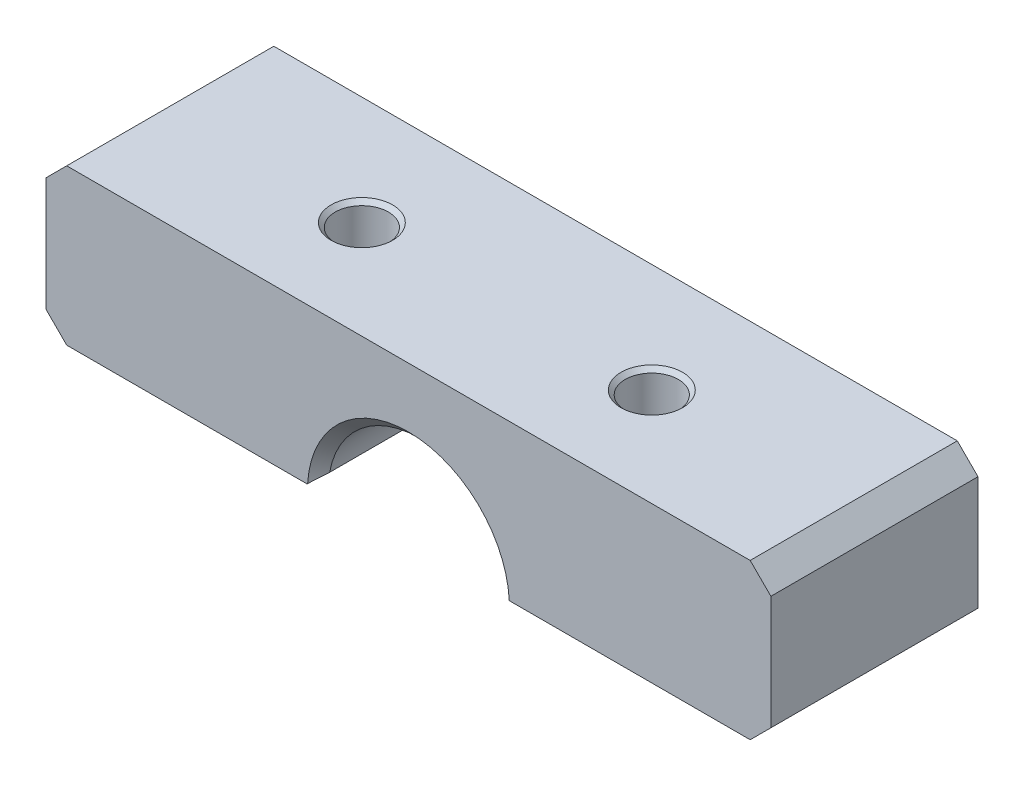
ISO-10303-21;
HEADER;
FILE_DESCRIPTION(('STEP AP214'),'2;1');
FILE_NAME('part.step','',(''),(''),'','','');
FILE_SCHEMA(('AUTOMOTIVE_DESIGN { 1 0 10303 214 1 1 1 1 }'));
ENDSEC;
DATA;
#1=APPLICATION_CONTEXT('core data for automotive mechanical design processes');
#2=APPLICATION_PROTOCOL_DEFINITION('international standard','automotive_design',2000,#1);
#3=PRODUCT_CONTEXT('',#1,'mechanical');
#4=PRODUCT('Part','Part','',(#3));
#5=PRODUCT_RELATED_PRODUCT_CATEGORY('part','',(#4));
#6=PRODUCT_DEFINITION_FORMATION('','',#4);
#7=PRODUCT_DEFINITION_CONTEXT('part definition',#1,'design');
#8=PRODUCT_DEFINITION('design','',#6,#7);
#9=PRODUCT_DEFINITION_SHAPE('','',#8);
#10=(LENGTH_UNIT() NAMED_UNIT(*) SI_UNIT(.MILLI.,.METRE.));
#11=(NAMED_UNIT(*) PLANE_ANGLE_UNIT() SI_UNIT($,.RADIAN.));
#12=(NAMED_UNIT(*) SI_UNIT($,.STERADIAN.) SOLID_ANGLE_UNIT());
#13=UNCERTAINTY_MEASURE_WITH_UNIT(LENGTH_MEASURE(1.E-05),#10,'distance_accuracy_value','');
#14=(GEOMETRIC_REPRESENTATION_CONTEXT(3) GLOBAL_UNCERTAINTY_ASSIGNED_CONTEXT((#13)) GLOBAL_UNIT_ASSIGNED_CONTEXT((#10,
#11,#12)) REPRESENTATION_CONTEXT('',''));
#15=CARTESIAN_POINT('',(0.,0.,0.));
#16=DIRECTION('',(0.,0.,1.));
#17=DIRECTION('',(1.,0.,0.));
#18=AXIS2_PLACEMENT_3D('',#15,#16,#17);
#19=CARTESIAN_POINT('',(0.,19.685,9.525));
#20=DIRECTION('',(0.,1.,0.));
#21=DIRECTION('',(-1.,0.,0.));
#22=AXIS2_PLACEMENT_3D('',#19,#20,#21);
#23=PLANE('',#22);
#24=CARTESIAN_POINT('',(-17.78,19.685,22.86));
#25=DIRECTION('',(0.,1.,0.));
#26=DIRECTION('',(-1.,0.,0.));
#27=AXIS2_PLACEMENT_3D('',#24,#25,#26);
#28=CIRCLE('',#27,3.77190000000004);
#29=CARTESIAN_POINT('',(-21.5519,19.685,22.86));
#30=VERTEX_POINT('',#29);
#31=EDGE_CURVE('E11',#30,#30,#28,.F.);
#32=ORIENTED_EDGE('',*,*,#31,.T.);
#33=EDGE_LOOP('',(#32));
#34=FACE_BOUND('',#33,.T.);
#35=CARTESIAN_POINT('',(17.78,19.685,22.86));
#36=DIRECTION('',(0.,1.,0.));
#37=DIRECTION('',(-1.,0.,0.));
#38=AXIS2_PLACEMENT_3D('',#35,#36,#37);
#39=CIRCLE('',#38,3.77190000000002);
#40=CARTESIAN_POINT('',(14.0081,19.685,22.86));
#41=VERTEX_POINT('',#40);
#42=EDGE_CURVE('E56',#41,#41,#39,.F.);
#43=ORIENTED_EDGE('',*,*,#42,.T.);
#44=EDGE_LOOP('',(#43));
#45=FACE_BOUND('',#44,.T.);
#46=DIRECTION('',(-1.,0.,0.));
#47=VECTOR('',#46,1.);
#48=CARTESIAN_POINT('',(0.,19.685,9.525));
#49=LINE('',#48,#47);
#50=CARTESIAN_POINT('',(41.91,19.685,9.525));
#51=VERTEX_POINT('',#50);
#52=CARTESIAN_POINT('',(-41.91,19.685,9.525));
#53=VERTEX_POINT('',#52);
#54=EDGE_CURVE('E307',#51,#53,#49,.T.);
#55=ORIENTED_EDGE('',*,*,#54,.T.);
#56=DIRECTION('',(0.,0.,1.));
#57=VECTOR('',#56,1.);
#58=CARTESIAN_POINT('',(-41.91,19.685,34.925));
#59=LINE('',#58,#57);
#60=CARTESIAN_POINT('',(-41.91,19.685,34.925));
#61=VERTEX_POINT('',#60);
#62=EDGE_CURVE('E202',#53,#61,#59,.T.);
#63=ORIENTED_EDGE('',*,*,#62,.T.);
#64=DIRECTION('',(-1.,0.,0.));
#65=VECTOR('',#64,1.);
#66=CARTESIAN_POINT('',(0.,19.685,34.925));
#67=LINE('',#66,#65);
#68=CARTESIAN_POINT('',(41.91,19.685,34.925));
#69=VERTEX_POINT('',#68);
#70=EDGE_CURVE('E168',#69,#61,#67,.T.);
#71=ORIENTED_EDGE('',*,*,#70,.F.);
#72=DIRECTION('',(0.,0.,-1.));
#73=VECTOR('',#72,1.);
#74=CARTESIAN_POINT('',(41.91,19.685,9.525));
#75=LINE('',#74,#73);
#76=EDGE_CURVE('E200',#69,#51,#75,.T.);
#77=ORIENTED_EDGE('',*,*,#76,.T.);
#78=EDGE_LOOP('',(#55,#63,#71,#77));
#79=FACE_BOUND('',#78,.T.);
#80=ADVANCED_FACE('F47',(#34,#45,#79),#23,.T.);
#81=CARTESIAN_POINT('',(44.45,0.,9.525));
#82=DIRECTION('',(1.,0.,0.));
#83=DIRECTION('',(0.,0.,-1.));
#84=AXIS2_PLACEMENT_3D('',#81,#82,#83);
#85=PLANE('',#84);
#86=DIRECTION('',(0.,1.,0.));
#87=VECTOR('',#86,1.);
#88=CARTESIAN_POINT('',(44.45,0.,9.525));
#89=LINE('',#88,#87);
#90=CARTESIAN_POINT('',(44.45,3.17499999999998,9.525));
#91=VERTEX_POINT('',#90);
#92=CARTESIAN_POINT('',(44.45,17.145,9.525));
#93=VERTEX_POINT('',#92);
#94=EDGE_CURVE('E303',#91,#93,#89,.T.);
#95=ORIENTED_EDGE('',*,*,#94,.T.);
#96=DIRECTION('',(0.,0.,1.));
#97=VECTOR('',#96,1.);
#98=CARTESIAN_POINT('',(44.45,17.145,9.525));
#99=LINE('',#98,#97);
#100=CARTESIAN_POINT('',(44.45,17.145,34.925));
#101=VERTEX_POINT('',#100);
#102=EDGE_CURVE('E207',#93,#101,#99,.T.);
#103=ORIENTED_EDGE('',*,*,#102,.T.);
#104=DIRECTION('',(0.,1.,0.));
#105=VECTOR('',#104,1.);
#106=CARTESIAN_POINT('',(44.45,0.,34.925));
#107=LINE('',#106,#105);
#108=CARTESIAN_POINT('',(44.45,3.17499999999998,34.925));
#109=VERTEX_POINT('',#108);
#110=EDGE_CURVE('E171',#109,#101,#107,.T.);
#111=ORIENTED_EDGE('',*,*,#110,.F.);
#112=DIRECTION('',(0.,0.,-1.));
#113=VECTOR('',#112,1.);
#114=CARTESIAN_POINT('',(44.45,3.17499999999998,9.525));
#115=LINE('',#114,#113);
#116=EDGE_CURVE('E205',#109,#91,#115,.T.);
#117=ORIENTED_EDGE('',*,*,#116,.T.);
#118=EDGE_LOOP('',(#95,#103,#111,#117));
#119=FACE_BOUND('',#118,.T.);
#120=ADVANCED_FACE('F249',(#119),#85,.T.);
#121=CARTESIAN_POINT('',(0.,0.635000000000019,9.525));
#122=DIRECTION('',(0.,1.,0.));
#123=DIRECTION('',(-1.,0.,0.));
#124=AXIS2_PLACEMENT_3D('',#121,#122,#123);
#125=PLANE('',#124);
#126=CARTESIAN_POINT('',(17.78,0.635000000000007,22.86));
#127=DIRECTION('',(0.,1.,0.));
#128=DIRECTION('',(-1.,0.,0.));
#129=AXIS2_PLACEMENT_3D('',#126,#127,#128);
#130=CIRCLE('',#129,3.77189999999999);
#131=CARTESIAN_POINT('',(14.0081,0.635000000000009,22.86));
#132=VERTEX_POINT('',#131);
#133=EDGE_CURVE('E329',#132,#132,#130,.T.);
#134=ORIENTED_EDGE('',*,*,#133,.T.);
#135=EDGE_LOOP('',(#134));
#136=FACE_BOUND('',#135,.T.);
#137=CARTESIAN_POINT('',(12.3662072297855,0.63500000000001,34.925));
#138=CARTESIAN_POINT('',(12.3658964095099,0.63500000000001,34.9246895887601));
#139=CARTESIAN_POINT('',(12.3655855892342,0.63500000000001,34.9243791775203));
#140=CARTESIAN_POINT('',(12.364963948683,0.63500000000001,34.9237583550406));
#141=CARTESIAN_POINT('',(12.3646531284073,0.63500000000001,34.9234479438007));
#142=CARTESIAN_POINT('',(12.3643423081317,0.63500000000001,34.9231375325609));
#143=B_SPLINE_CURVE_WITH_KNOTS('',3,(#137,#138,#139,#140,#141,#142),.UNSPECIFIED.,.F.,.F.,(4,2,
4),(0.,0.00131783133754395,0.002635662675083),.UNSPECIFIED.);
#144=CARTESIAN_POINT('',(12.3662072297855,0.63500000000001,34.925));
#145=VERTEX_POINT('',#144);
#146=CARTESIAN_POINT('',(12.3643423081317,0.63500000000001,34.9231375325609));
#147=VERTEX_POINT('',#146);
#148=EDGE_CURVE('E63',#145,#147,#143,.T.);
#149=ORIENTED_EDGE('',*,*,#148,.T.);
#150=DIRECTION('',(0.,0.,-1.));
#151=VECTOR('',#150,1.);
#152=CARTESIAN_POINT('',(12.3643423081317,0.63500000000001,9.525));
#153=LINE('',#152,#151);
#154=CARTESIAN_POINT('',(12.3643423081317,0.63500000000001,9.525));
#155=VERTEX_POINT('',#154);
#156=EDGE_CURVE('E67',#147,#155,#153,.T.);
#157=ORIENTED_EDGE('',*,*,#156,.T.);
#158=DIRECTION('',(-1.,0.,0.));
#159=VECTOR('',#158,1.);
#160=CARTESIAN_POINT('',(0.,0.635000000000019,9.525));
#161=LINE('',#160,#159);
#162=CARTESIAN_POINT('',(41.91,0.634999999999991,9.525));
#163=VERTEX_POINT('',#162);
#164=EDGE_CURVE('E300',#163,#155,#161,.T.);
#165=ORIENTED_EDGE('',*,*,#164,.F.);
#166=DIRECTION('',(0.,0.,1.));
#167=VECTOR('',#166,1.);
#168=CARTESIAN_POINT('',(41.91,0.634999999999991,34.925));
#169=LINE('',#168,#167);
#170=CARTESIAN_POINT('',(41.91,0.634999999999991,34.925));
#171=VERTEX_POINT('',#170);
#172=EDGE_CURVE('E210',#163,#171,#169,.T.);
#173=ORIENTED_EDGE('',*,*,#172,.T.);
#174=DIRECTION('',(-1.,0.,0.));
#175=VECTOR('',#174,1.);
#176=CARTESIAN_POINT('',(0.,0.635000000000019,34.925));
#177=LINE('',#176,#175);
#178=EDGE_CURVE('E182',#171,#145,#177,.T.);
#179=ORIENTED_EDGE('',*,*,#178,.T.);
#180=EDGE_LOOP('',(#149,#157,#165,#173,#179));
#181=FACE_BOUND('',#180,.T.);
#182=ADVANCED_FACE('F243',(#136,#181),#125,.F.);
#183=CARTESIAN_POINT('',(0.,0.,9.525));
#184=DIRECTION('',(0.,0.,1.));
#185=DIRECTION('',(1.,0.,0.));
#186=AXIS2_PLACEMENT_3D('',#183,#184,#185);
#187=CYLINDRICAL_SURFACE('',#186,11.1125);
#188=CARTESIAN_POINT('',(0.,0.,33.655));
#189=DIRECTION('',(0.,0.,1.));
#190=DIRECTION('',(1.,0.,0.));
#191=AXIS2_PLACEMENT_3D('',#188,#189,#190);
#192=CIRCLE('',#191,11.1125);
#193=CARTESIAN_POINT('',(10.915336790638,2.08400551749363,33.655));
#194=VERTEX_POINT('',#193);
#195=CARTESIAN_POINT('',(-10.9345550606117,1.98069732075622,33.655));
#196=VERTEX_POINT('',#195);
#197=EDGE_CURVE('E220',#194,#196,#192,.T.);
#198=ORIENTED_EDGE('',*,*,#197,.T.);
#199=DIRECTION('',(0.,0.,1.));
#200=VECTOR('',#199,1.);
#201=CARTESIAN_POINT('',(-10.9345550606117,1.98069732075622,9.525));
#202=LINE('',#201,#200);
#203=CARTESIAN_POINT('',(-10.9345550606117,1.98069732075622,9.525));
#204=VERTEX_POINT('',#203);
#205=EDGE_CURVE('E224',#196,#204,#202,.F.);
#206=ORIENTED_EDGE('',*,*,#205,.T.);
#207=CARTESIAN_POINT('',(0.,0.,9.525));
#208=DIRECTION('',(0.,0.,1.));
#209=DIRECTION('',(1.,0.,0.));
#210=AXIS2_PLACEMENT_3D('',#207,#208,#209);
#211=CIRCLE('',#210,11.1125);
#212=CARTESIAN_POINT('',(10.915336790638,2.08400551749363,9.525));
#213=VERTEX_POINT('',#212);
#214=EDGE_CURVE('E305',#213,#204,#211,.T.);
#215=ORIENTED_EDGE('',*,*,#214,.F.);
#216=DIRECTION('',(0.,0.,1.));
#217=VECTOR('',#216,1.);
#218=CARTESIAN_POINT('',(10.915336790638,2.08400551749363,9.525));
#219=LINE('',#218,#217);
#220=EDGE_CURVE('E222',#213,#194,#219,.T.);
#221=ORIENTED_EDGE('',*,*,#220,.T.);
#222=EDGE_LOOP('',(#198,#206,#215,#221));
#223=FACE_BOUND('',#222,.T.);
#224=ADVANCED_FACE('F248',(#223),#187,.F.);
#225=CARTESIAN_POINT('',(0.,0.635000000000008,9.525));
#226=DIRECTION('',(0.,-1.,0.));
#227=DIRECTION('',(1.,0.,0.));
#228=AXIS2_PLACEMENT_3D('',#225,#226,#227);
#229=PLANE('',#228);
#230=CARTESIAN_POINT('',(-17.78,0.635000000000005,22.86));
#231=DIRECTION('',(0.,-1.,0.));
#232=DIRECTION('',(1.,0.,0.));
#233=AXIS2_PLACEMENT_3D('',#230,#231,#232);
#234=CIRCLE('',#233,3.7719);
#235=CARTESIAN_POINT('',(-14.0081,0.635000000000005,22.86));
#236=VERTEX_POINT('',#235);
#237=EDGE_CURVE('E344',#236,#236,#234,.F.);
#238=ORIENTED_EDGE('',*,*,#237,.T.);
#239=EDGE_LOOP('',(#238));
#240=FACE_BOUND('',#239,.T.);
#241=DIRECTION('',(1.,0.,0.));
#242=VECTOR('',#241,1.);
#243=CARTESIAN_POINT('',(0.,0.635000000000008,9.525));
#244=LINE('',#243,#242);
#245=CARTESIAN_POINT('',(-41.91,0.635,9.525));
#246=VERTEX_POINT('',#245);
#247=CARTESIAN_POINT('',(-12.4436503797327,0.635000000000006,9.525));
#248=VERTEX_POINT('',#247);
#249=EDGE_CURVE('E177',#246,#248,#244,.T.);
#250=ORIENTED_EDGE('',*,*,#249,.T.);
#251=DIRECTION('',(0.,0.,1.));
#252=VECTOR('',#251,1.);
#253=CARTESIAN_POINT('',(-12.4436503797327,0.635000000000006,34.925));
#254=LINE('',#253,#252);
#255=CARTESIAN_POINT('',(-12.4436503797327,0.635000000000006,34.925));
#256=VERTEX_POINT('',#255);
#257=EDGE_CURVE('E213',#248,#256,#254,.T.);
#258=ORIENTED_EDGE('',*,*,#257,.T.);
#259=DIRECTION('',(1.,0.,0.));
#260=VECTOR('',#259,1.);
#261=CARTESIAN_POINT('',(0.,0.635000000000008,34.925));
#262=LINE('',#261,#260);
#263=CARTESIAN_POINT('',(-41.91,0.635,34.925));
#264=VERTEX_POINT('',#263);
#265=EDGE_CURVE('E184',#264,#256,#262,.T.);
#266=ORIENTED_EDGE('',*,*,#265,.F.);
#267=DIRECTION('',(0.,0.,-1.));
#268=VECTOR('',#267,1.);
#269=CARTESIAN_POINT('',(-41.91,0.635,9.525));
#270=LINE('',#269,#268);
#271=EDGE_CURVE('E148',#264,#246,#270,.T.);
#272=ORIENTED_EDGE('',*,*,#271,.T.);
#273=EDGE_LOOP('',(#250,#258,#266,#272));
#274=FACE_BOUND('',#273,.T.);
#275=ADVANCED_FACE('F375',(#240,#274),#229,.T.);
#276=CARTESIAN_POINT('',(0.,0.,9.525));
#277=DIRECTION('',(0.,0.,1.));
#278=DIRECTION('',(1.,0.,0.));
#279=AXIS2_PLACEMENT_3D('',#276,#277,#278);
#280=PLANE('',#279);
#281=ORIENTED_EDGE('',*,*,#214,.T.);
#282=DIRECTION('',(0.746357478959563,0.66554527539539,0.));
#283=VECTOR('',#282,1.);
#284=CARTESIAN_POINT('',(-12.4436503797327,0.635000000000006,9.525));
#285=LINE('',#284,#283);
#286=EDGE_CURVE('E228',#204,#248,#285,.F.);
#287=ORIENTED_EDGE('',*,*,#286,.T.);
#288=ORIENTED_EDGE('',*,*,#249,.F.);
#289=DIRECTION('',(-0.70710678118655,0.707106781186546,0.));
#290=VECTOR('',#289,1.);
#291=CARTESIAN_POINT('',(-44.45,3.175,9.525));
#292=LINE('',#291,#290);
#293=CARTESIAN_POINT('',(-44.45,3.175,9.525));
#294=VERTEX_POINT('',#293);
#295=EDGE_CURVE('E198',#246,#294,#292,.T.);
#296=ORIENTED_EDGE('',*,*,#295,.T.);
#297=DIRECTION('',(0.,1.,0.));
#298=VECTOR('',#297,1.);
#299=CARTESIAN_POINT('',(-44.45,0.,9.525));
#300=LINE('',#299,#298);
#301=CARTESIAN_POINT('',(-44.45,17.145,9.525));
#302=VERTEX_POINT('',#301);
#303=EDGE_CURVE('E162',#294,#302,#300,.T.);
#304=ORIENTED_EDGE('',*,*,#303,.T.);
#305=DIRECTION('',(0.707106781186548,0.707106781186548,0.));
#306=VECTOR('',#305,1.);
#307=CARTESIAN_POINT('',(-41.91,19.685,9.525));
#308=LINE('',#307,#306);
#309=EDGE_CURVE('E196',#302,#53,#308,.T.);
#310=ORIENTED_EDGE('',*,*,#309,.T.);
#311=ORIENTED_EDGE('',*,*,#54,.F.);
#312=DIRECTION('',(-0.707106781186546,0.707106781186549,0.));
#313=VECTOR('',#312,1.);
#314=CARTESIAN_POINT('',(44.45,17.145,9.525));
#315=LINE('',#314,#313);
#316=EDGE_CURVE('E194',#51,#93,#315,.F.);
#317=ORIENTED_EDGE('',*,*,#316,.T.);
#318=ORIENTED_EDGE('',*,*,#94,.F.);
#319=DIRECTION('',(-0.707106781186546,-0.707106781186549,0.));
#320=VECTOR('',#319,1.);
#321=CARTESIAN_POINT('',(41.91,0.634999999999991,9.525));
#322=LINE('',#321,#320);
#323=EDGE_CURVE('E192',#91,#163,#322,.T.);
#324=ORIENTED_EDGE('',*,*,#323,.T.);
#325=ORIENTED_EDGE('',*,*,#164,.T.);
#326=DIRECTION('',(0.707106781186552,-0.707106781186543,0.));
#327=VECTOR('',#326,1.);
#328=CARTESIAN_POINT('',(10.915336790638,2.08400551749363,9.525));
#329=LINE('',#328,#327);
#330=EDGE_CURVE('E226',#155,#213,#329,.F.);
#331=ORIENTED_EDGE('',*,*,#330,.T.);
#332=EDGE_LOOP('',(#281,#287,#288,#296,#304,#310,#311,#317,#318,#324,#325,#331));
#333=FACE_BOUND('',#332,.T.);
#334=ADVANCED_FACE('F299',(#333),#280,.F.);
#335=CARTESIAN_POINT('',(0.,0.,34.925));
#336=DIRECTION('',(0.,0.,1.));
#337=DIRECTION('',(1.,0.,0.));
#338=AXIS2_PLACEMENT_3D('',#335,#336,#337);
#339=PLANE('',#338);
#340=ORIENTED_EDGE('',*,*,#265,.T.);
#341=DIRECTION('',(-0.746357478959563,-0.66554527539539,0.));
#342=VECTOR('',#341,1.);
#343=CARTESIAN_POINT('',(-5.82734785738767,6.53491928595906,34.925));
#344=LINE('',#343,#342);
#345=CARTESIAN_POINT('',(-12.3622671433467,0.707571428571431,34.925));
#346=VERTEX_POINT('',#345);
#347=EDGE_CURVE('E218',#256,#346,#344,.F.);
#348=ORIENTED_EDGE('',*,*,#347,.T.);
#349=CARTESIAN_POINT('',(0.,0.,34.925));
#350=DIRECTION('',(0.,0.,1.));
#351=DIRECTION('',(1.,0.,0.));
#352=AXIS2_PLACEMENT_3D('',#349,#350,#351);
#353=CIRCLE('',#352,12.3825);
#354=EDGE_CURVE('E216',#346,#145,#353,.F.);
#355=ORIENTED_EDGE('',*,*,#354,.T.);
#356=ORIENTED_EDGE('',*,*,#178,.F.);
#357=DIRECTION('',(0.707106781186546,0.707106781186549,0.));
#358=VECTOR('',#357,1.);
#359=CARTESIAN_POINT('',(20.6375000000001,-20.6375,34.925));
#360=LINE('',#359,#358);
#361=EDGE_CURVE('E163',#171,#109,#360,.T.);
#362=ORIENTED_EDGE('',*,*,#361,.T.);
#363=ORIENTED_EDGE('',*,*,#110,.T.);
#364=DIRECTION('',(0.707106781186546,-0.707106781186549,0.));
#365=VECTOR('',#364,1.);
#366=CARTESIAN_POINT('',(30.7975000000001,30.7975,34.925));
#367=LINE('',#366,#365);
#368=EDGE_CURVE('E188',#101,#69,#367,.F.);
#369=ORIENTED_EDGE('',*,*,#368,.T.);
#370=ORIENTED_EDGE('',*,*,#70,.T.);
#371=DIRECTION('',(-0.707106781186548,-0.707106781186548,0.));
#372=VECTOR('',#371,1.);
#373=CARTESIAN_POINT('',(-30.7975,30.7975,34.925));
#374=LINE('',#373,#372);
#375=CARTESIAN_POINT('',(-44.45,17.145,34.925));
#376=VERTEX_POINT('',#375);
#377=EDGE_CURVE('E153',#61,#376,#374,.T.);
#378=ORIENTED_EDGE('',*,*,#377,.T.);
#379=DIRECTION('',(0.,1.,0.));
#380=VECTOR('',#379,1.);
#381=CARTESIAN_POINT('',(-44.45,0.,34.925));
#382=LINE('',#381,#380);
#383=CARTESIAN_POINT('',(-44.45,3.175,34.925));
#384=VERTEX_POINT('',#383);
#385=EDGE_CURVE('E159',#384,#376,#382,.T.);
#386=ORIENTED_EDGE('',*,*,#385,.F.);
#387=DIRECTION('',(0.70710678118655,-0.707106781186546,0.));
#388=VECTOR('',#387,1.);
#389=CARTESIAN_POINT('',(-20.6374999999999,-20.6375,34.925));
#390=LINE('',#389,#388);
#391=EDGE_CURVE('E143',#384,#264,#390,.T.);
#392=ORIENTED_EDGE('',*,*,#391,.T.);
#393=EDGE_LOOP('',(#340,#348,#355,#356,#362,#363,#369,#370,#378,#386,#392));
#394=FACE_BOUND('',#393,.T.);
#395=ADVANCED_FACE('F166',(#394),#339,.T.);
#396=CARTESIAN_POINT('',(-17.78,-44.45,22.86));
#397=DIRECTION('',(0.,1.,0.));
#398=DIRECTION('',(0.,0.,1.));
#399=AXIS2_PLACEMENT_3D('',#396,#397,#398);
#400=CYLINDRICAL_SURFACE('',#399,3.2639);
#401=CARTESIAN_POINT('',(-17.78,1.14300000000001,22.86));
#402=DIRECTION('',(0.,-1.,0.));
#403=DIRECTION('',(0.,0.,-1.));
#404=AXIS2_PLACEMENT_3D('',#401,#402,#403);
#405=CIRCLE('',#404,3.2639);
#406=CARTESIAN_POINT('',(-17.78,1.14300000000001,19.5961));
#407=VERTEX_POINT('',#406);
#408=EDGE_CURVE('E350',#407,#407,#405,.T.);
#409=ORIENTED_EDGE('',*,*,#408,.T.);
#410=EDGE_LOOP('',(#409));
#411=FACE_BOUND('',#410,.T.);
#412=CARTESIAN_POINT('',(-17.78,19.177,22.86));
#413=DIRECTION('',(0.,1.,0.));
#414=DIRECTION('',(0.,0.,1.));
#415=AXIS2_PLACEMENT_3D('',#412,#413,#414);
#416=CIRCLE('',#415,3.2639);
#417=CARTESIAN_POINT('',(-17.78,19.177,26.1239));
#418=VERTEX_POINT('',#417);
#419=EDGE_CURVE('E347',#418,#418,#416,.T.);
#420=ORIENTED_EDGE('',*,*,#419,.T.);
#421=EDGE_LOOP('',(#420));
#422=FACE_BOUND('',#421,.T.);
#423=ADVANCED_FACE('F362',(#411,#422),#400,.F.);
#424=CARTESIAN_POINT('',(17.78,-44.45,22.86));
#425=DIRECTION('',(0.,1.,0.));
#426=DIRECTION('',(0.,0.,1.));
#427=AXIS2_PLACEMENT_3D('',#424,#425,#426);
#428=CYLINDRICAL_SURFACE('',#427,3.2639);
#429=CARTESIAN_POINT('',(17.78,1.143,22.86));
#430=DIRECTION('',(0.,1.,0.));
#431=DIRECTION('',(0.,0.,1.));
#432=AXIS2_PLACEMENT_3D('',#429,#430,#431);
#433=CIRCLE('',#432,3.2639);
#434=CARTESIAN_POINT('',(17.78,1.143,26.1239));
#435=VERTEX_POINT('',#434);
#436=EDGE_CURVE('E335',#435,#435,#433,.F.);
#437=ORIENTED_EDGE('',*,*,#436,.T.);
#438=EDGE_LOOP('',(#437));
#439=FACE_BOUND('',#438,.T.);
#440=CARTESIAN_POINT('',(17.78,19.177,22.86));
#441=DIRECTION('',(0.,1.,0.));
#442=DIRECTION('',(0.,0.,1.));
#443=AXIS2_PLACEMENT_3D('',#440,#441,#442);
#444=CIRCLE('',#443,3.2639);
#445=CARTESIAN_POINT('',(17.78,19.177,26.1239));
#446=VERTEX_POINT('',#445);
#447=EDGE_CURVE('E331',#446,#446,#444,.T.);
#448=ORIENTED_EDGE('',*,*,#447,.T.);
#449=EDGE_LOOP('',(#448));
#450=FACE_BOUND('',#449,.T.);
#451=ADVANCED_FACE('F267',(#439,#450),#428,.F.);
#452=CARTESIAN_POINT('',(-44.45,3.175,9.525));
#453=DIRECTION('',(-0.707106781186546,-0.70710678118655,0.));
#454=DIRECTION('',(0.,0.,-1.));
#455=AXIS2_PLACEMENT_3D('',#452,#453,#454);
#456=PLANE('',#455);
#457=ORIENTED_EDGE('',*,*,#295,.F.);
#458=ORIENTED_EDGE('',*,*,#271,.F.);
#459=ORIENTED_EDGE('',*,*,#391,.F.);
#460=DIRECTION('',(0.,0.,1.));
#461=VECTOR('',#460,1.);
#462=CARTESIAN_POINT('',(-44.45,3.175,34.925));
#463=LINE('',#462,#461);
#464=EDGE_CURVE('E147',#294,#384,#463,.T.);
#465=ORIENTED_EDGE('',*,*,#464,.F.);
#466=EDGE_LOOP('',(#457,#458,#459,#465));
#467=FACE_BOUND('',#466,.T.);
#468=ADVANCED_FACE('F146',(#467),#456,.T.);
#469=CARTESIAN_POINT('',(-41.91,19.685,9.525));
#470=DIRECTION('',(-0.707106781186548,0.707106781186548,0.));
#471=DIRECTION('',(0.,0.,-1.));
#472=AXIS2_PLACEMENT_3D('',#469,#470,#471);
#473=PLANE('',#472);
#474=ORIENTED_EDGE('',*,*,#309,.F.);
#475=DIRECTION('',(0.,0.,-1.));
#476=VECTOR('',#475,1.);
#477=CARTESIAN_POINT('',(-44.45,17.145,9.525));
#478=LINE('',#477,#476);
#479=EDGE_CURVE('E164',#376,#302,#478,.T.);
#480=ORIENTED_EDGE('',*,*,#479,.F.);
#481=ORIENTED_EDGE('',*,*,#377,.F.);
#482=ORIENTED_EDGE('',*,*,#62,.F.);
#483=EDGE_LOOP('',(#474,#480,#481,#482));
#484=FACE_BOUND('',#483,.T.);
#485=ADVANCED_FACE('F266',(#484),#473,.T.);
#486=CARTESIAN_POINT('',(44.45,17.145,9.525));
#487=DIRECTION('',(-0.707106781186549,-0.707106781186546,0.));
#488=DIRECTION('',(0.,0.,1.));
#489=AXIS2_PLACEMENT_3D('',#486,#487,#488);
#490=PLANE('',#489);
#491=ORIENTED_EDGE('',*,*,#316,.F.);
#492=ORIENTED_EDGE('',*,*,#76,.F.);
#493=ORIENTED_EDGE('',*,*,#368,.F.);
#494=ORIENTED_EDGE('',*,*,#102,.F.);
#495=EDGE_LOOP('',(#491,#492,#493,#494));
#496=FACE_BOUND('',#495,.T.);
#497=ADVANCED_FACE('F273',(#496),#490,.F.);
#498=CARTESIAN_POINT('',(41.91,0.634999999999991,9.525));
#499=DIRECTION('',(0.707106781186549,-0.707106781186546,0.));
#500=DIRECTION('',(0.,0.,-1.));
#501=AXIS2_PLACEMENT_3D('',#498,#499,#500);
#502=PLANE('',#501);
#503=ORIENTED_EDGE('',*,*,#323,.F.);
#504=ORIENTED_EDGE('',*,*,#116,.F.);
#505=ORIENTED_EDGE('',*,*,#361,.F.);
#506=ORIENTED_EDGE('',*,*,#172,.F.);
#507=EDGE_LOOP('',(#503,#504,#505,#506));
#508=FACE_BOUND('',#507,.T.);
#509=ADVANCED_FACE('F279',(#508),#502,.T.);
#510=CARTESIAN_POINT('',(10.915336790638,2.08400551749363,9.525));
#511=DIRECTION('',(0.707106781186543,0.707106781186552,0.));
#512=DIRECTION('',(0.,0.,1.));
#513=AXIS2_PLACEMENT_3D('',#510,#511,#512);
#514=PLANE('',#513);
#515=ORIENTED_EDGE('',*,*,#330,.F.);
#516=ORIENTED_EDGE('',*,*,#156,.F.);
#517=CARTESIAN_POINT('',(10.915336790638,2.08400551749363,33.655));
#518=CARTESIAN_POINT('',(11.0391907518459,1.96015155628581,33.7534428716727));
#519=CARTESIAN_POINT('',(11.1621896970474,1.83715261108425,33.8540124396188));
#520=CARTESIAN_POINT('',(11.4065609329492,1.5927813751825,34.0588861103008));
#521=CARTESIAN_POINT('',(11.5279338235084,1.47140848462327,34.1631887806555));
#522=CARTESIAN_POINT('',(11.7692225556425,1.23011975248916,34.3750785859531));
#523=CARTESIAN_POINT('',(11.8891384887775,1.11020381935414,34.4826655129942));
#524=CARTESIAN_POINT('',(12.1276858984699,0.871656409661796,34.7007913600172));
#525=CARTESIAN_POINT('',(12.2463168702259,0.753025437905791,34.8113313849522));
#526=CARTESIAN_POINT('',(12.3643423081317,0.635000000000012,34.9231375325609));
#527=B_SPLINE_CURVE_WITH_KNOTS('',3,(#517,#518,#519,#520,#521,#522,#523,#524,#525,#526),
.UNSPECIFIED.,.F.,.F.,(4,2,2,2,4),(0.,0.602740826428273,1.20525281130001,1.80772673437368,
2.41042933122314),.UNSPECIFIED.);
#528=EDGE_CURVE('E169',#194,#147,#527,.T.);
#529=ORIENTED_EDGE('',*,*,#528,.F.);
#530=ORIENTED_EDGE('',*,*,#220,.F.);
#531=EDGE_LOOP('',(#515,#516,#529,#530));
#532=FACE_BOUND('',#531,.T.);
#533=ADVANCED_FACE('F285',(#532),#514,.F.);
#534=CARTESIAN_POINT('',(0.,0.,33.655));
#535=DIRECTION('',(0.,0.,1.));
#536=DIRECTION('',(1.,0.,0.));
#537=AXIS2_PLACEMENT_3D('',#534,#535,#536);
#538=CONICAL_SURFACE('',#537,11.1125,0.785398163397448);
#539=ORIENTED_EDGE('',*,*,#148,.F.);
#540=ORIENTED_EDGE('',*,*,#354,.F.);
#541=CARTESIAN_POINT('',(-12.3622671433467,0.707571428571431,34.925));
#542=CARTESIAN_POINT('',(-12.2456306904634,0.811579015208841,34.8145052418855));
#543=CARTESIAN_POINT('',(-12.1284767693423,0.916048040969657,34.7049838480313));
#544=CARTESIAN_POINT('',(-11.8930592126454,1.12597565209663,34.4881901126722));
#545=CARTESIAN_POINT('',(-11.7747958619725,1.23143398340794,34.3809172154637));
#546=CARTESIAN_POINT('',(-11.5370215371945,1.44346318245464,34.168862887907));
#547=CARTESIAN_POINT('',(-11.4175105120074,1.55003409574111,34.0640815601483));
#548=CARTESIAN_POINT('',(-11.1770980131449,1.76441581934496,33.857334810946));
#549=CARTESIAN_POINT('',(-11.0561961988621,1.87222693339024,33.7553701010292));
#550=CARTESIAN_POINT('',(-10.9345550606117,1.98069732075621,33.655));
#551=B_SPLINE_CURVE_WITH_KNOTS('',3,(#541,#542,#543,#544,#545,#546,#547,#548,#549,#550),
.UNSPECIFIED.,.F.,.F.,(4,2,2,2,4),(0.,0.574176930788886,1.1482102425954,1.72226714924174,
2.29646777055696),.UNSPECIFIED.);
#552=EDGE_CURVE('E174',#196,#346,#551,.F.);
#553=ORIENTED_EDGE('',*,*,#552,.F.);
#554=ORIENTED_EDGE('',*,*,#197,.F.);
#555=ORIENTED_EDGE('',*,*,#528,.T.);
#556=EDGE_LOOP('',(#539,#540,#553,#554,#555));
#557=FACE_BOUND('',#556,.T.);
#558=ADVANCED_FACE('F239',(#557),#538,.F.);
#559=CARTESIAN_POINT('',(-12.4436503797327,0.635000000000006,9.525));
#560=DIRECTION('',(-0.66554527539539,0.746357478959563,0.));
#561=DIRECTION('',(0.,0.,1.));
#562=AXIS2_PLACEMENT_3D('',#559,#560,#561);
#563=PLANE('',#562);
#564=ORIENTED_EDGE('',*,*,#286,.F.);
#565=ORIENTED_EDGE('',*,*,#205,.F.);
#566=ORIENTED_EDGE('',*,*,#552,.T.);
#567=ORIENTED_EDGE('',*,*,#347,.F.);
#568=ORIENTED_EDGE('',*,*,#257,.F.);
#569=EDGE_LOOP('',(#564,#565,#566,#567,#568));
#570=FACE_BOUND('',#569,.T.);
#571=ADVANCED_FACE('F391',(#570),#563,.F.);
#572=CARTESIAN_POINT('',(17.78,0.635000000000004,22.86));
#573=DIRECTION('',(0.,-1.,0.));
#574=DIRECTION('',(0.,0.,-1.));
#575=AXIS2_PLACEMENT_3D('',#572,#573,#574);
#576=CONICAL_SURFACE('',#575,3.77189999999999,0.785398163397447);
#577=ORIENTED_EDGE('',*,*,#436,.F.);
#578=EDGE_LOOP('',(#577));
#579=FACE_BOUND('',#578,.T.);
#580=ORIENTED_EDGE('',*,*,#133,.F.);
#581=EDGE_LOOP('',(#580));
#582=FACE_BOUND('',#581,.T.);
#583=ADVANCED_FACE('F402',(#579,#582),#576,.F.);
#584=CARTESIAN_POINT('',(-17.78,0.635000000000011,22.86));
#585=DIRECTION('',(0.,-1.,0.));
#586=DIRECTION('',(0.,0.,-1.));
#587=AXIS2_PLACEMENT_3D('',#584,#585,#586);
#588=CONICAL_SURFACE('',#587,3.77189999999999,0.785398163397447);
#589=ORIENTED_EDGE('',*,*,#408,.F.);
#590=EDGE_LOOP('',(#589));
#591=FACE_BOUND('',#590,.T.);
#592=ORIENTED_EDGE('',*,*,#237,.F.);
#593=EDGE_LOOP('',(#592));
#594=FACE_BOUND('',#593,.T.);
#595=ADVANCED_FACE('F413',(#591,#594),#588,.F.);
#596=CARTESIAN_POINT('',(-17.78,19.685,22.86));
#597=DIRECTION('',(0.,1.,0.));
#598=DIRECTION('',(0.,0.,1.));
#599=AXIS2_PLACEMENT_3D('',#596,#597,#598);
#600=CONICAL_SURFACE('',#599,3.77190000000004,0.785398163397447);
#601=ORIENTED_EDGE('',*,*,#419,.F.);
#602=EDGE_LOOP('',(#601));
#603=FACE_BOUND('',#602,.T.);
#604=ORIENTED_EDGE('',*,*,#31,.F.);
#605=EDGE_LOOP('',(#604));
#606=FACE_BOUND('',#605,.T.);
#607=ADVANCED_FACE('F358',(#603,#606),#600,.F.);
#608=CARTESIAN_POINT('',(17.78,19.177,22.86));
#609=DIRECTION('',(0.,1.,0.));
#610=DIRECTION('',(0.,0.,1.));
#611=AXIS2_PLACEMENT_3D('',#608,#609,#610);
#612=CONICAL_SURFACE('',#611,3.2639,0.785398163397461);
#613=ORIENTED_EDGE('',*,*,#42,.F.);
#614=EDGE_LOOP('',(#613));
#615=FACE_BOUND('',#614,.T.);
#616=ORIENTED_EDGE('',*,*,#447,.F.);
#617=EDGE_LOOP('',(#616));
#618=FACE_BOUND('',#617,.T.);
#619=ADVANCED_FACE('F50',(#615,#618),#612,.F.);
#620=CARTESIAN_POINT('',(-44.45,0.,9.525));
#621=DIRECTION('',(1.,0.,0.));
#622=DIRECTION('',(0.,0.,-1.));
#623=AXIS2_PLACEMENT_3D('',#620,#621,#622);
#624=PLANE('',#623);
#625=ORIENTED_EDGE('',*,*,#303,.F.);
#626=ORIENTED_EDGE('',*,*,#464,.T.);
#627=ORIENTED_EDGE('',*,*,#385,.T.);
#628=ORIENTED_EDGE('',*,*,#479,.T.);
#629=EDGE_LOOP('',(#625,#626,#627,#628));
#630=FACE_BOUND('',#629,.T.);
#631=ADVANCED_FACE('F158',(#630),#624,.F.);
#632=CLOSED_SHELL('',(#80,#120,#182,#224,#275,#334,#395,#423,#451,#468,#485,#497,#509,#533,#558,
#571,#583,#595,#607,#619,#631));
#633=MANIFOLD_SOLID_BREP('B2',#632);
#634=ADVANCED_BREP_SHAPE_REPRESENTATION('',(#18,#633),#14);
#635=SHAPE_DEFINITION_REPRESENTATION(#9,#634);
ENDSEC;
END-ISO-10303-21;
